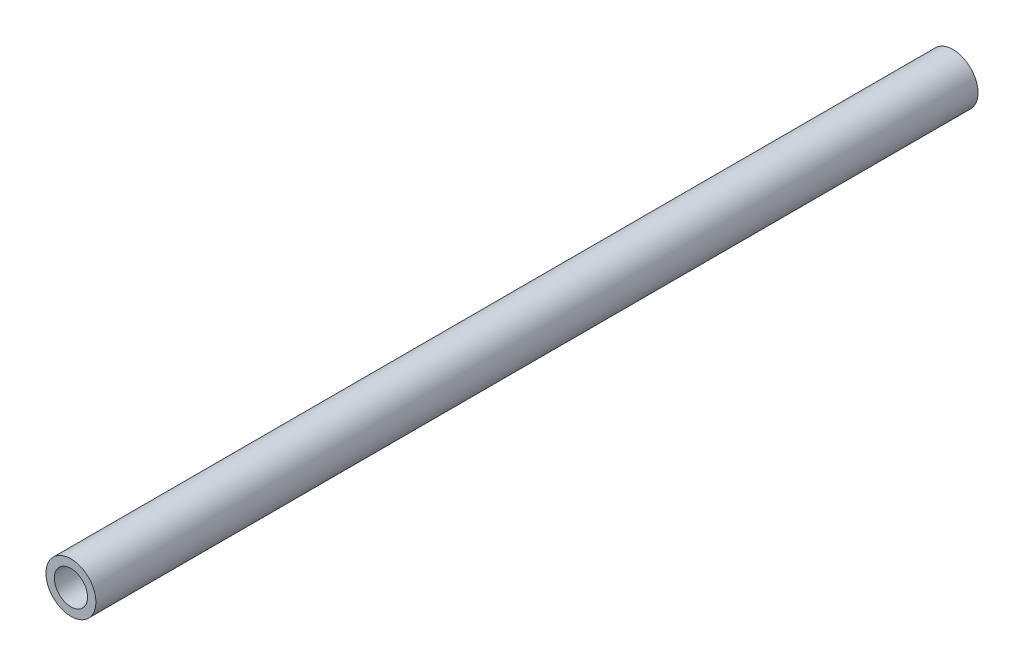
ISO-10303-21;
HEADER;
FILE_DESCRIPTION(('STEP AP214'),'2;1');
FILE_NAME('part.step','',(''),(''),'','','');
FILE_SCHEMA(('AUTOMOTIVE_DESIGN { 1 0 10303 214 1 1 1 1 }'));
ENDSEC;
DATA;
#1=APPLICATION_CONTEXT('core data for automotive mechanical design processes');
#2=APPLICATION_PROTOCOL_DEFINITION('international standard','automotive_design',2000,#1);
#3=PRODUCT_CONTEXT('',#1,'mechanical');
#4=PRODUCT('Part','Part','',(#3));
#5=PRODUCT_RELATED_PRODUCT_CATEGORY('part','',(#4));
#6=PRODUCT_DEFINITION_FORMATION('','',#4);
#7=PRODUCT_DEFINITION_CONTEXT('part definition',#1,'design');
#8=PRODUCT_DEFINITION('design','',#6,#7);
#9=PRODUCT_DEFINITION_SHAPE('','',#8);
#10=(LENGTH_UNIT() NAMED_UNIT(*) SI_UNIT(.MILLI.,.METRE.));
#11=(NAMED_UNIT(*) PLANE_ANGLE_UNIT() SI_UNIT($,.RADIAN.));
#12=(NAMED_UNIT(*) SI_UNIT($,.STERADIAN.) SOLID_ANGLE_UNIT());
#13=UNCERTAINTY_MEASURE_WITH_UNIT(LENGTH_MEASURE(1.E-05),#10,'distance_accuracy_value','');
#14=(GEOMETRIC_REPRESENTATION_CONTEXT(3) GLOBAL_UNCERTAINTY_ASSIGNED_CONTEXT((#13)) GLOBAL_UNIT_ASSIGNED_CONTEXT((#10,
#11,#12)) REPRESENTATION_CONTEXT('',''));
#15=CARTESIAN_POINT('',(0.,0.,0.));
#16=DIRECTION('',(0.,0.,1.));
#17=DIRECTION('',(1.,0.,0.));
#18=AXIS2_PLACEMENT_3D('',#15,#16,#17);
#19=CARTESIAN_POINT('',(0.,0.,265.));
#20=DIRECTION('',(0.,0.,1.));
#21=DIRECTION('',(1.,0.,0.));
#22=AXIS2_PLACEMENT_3D('',#19,#20,#21);
#23=PLANE('',#22);
#24=CARTESIAN_POINT('',(0.,0.,265.));
#25=DIRECTION('',(0.,0.,1.));
#26=DIRECTION('',(1.,0.,0.));
#27=AXIS2_PLACEMENT_3D('',#24,#25,#26);
#28=CIRCLE('',#27,7.5);
#29=CARTESIAN_POINT('',(7.5,0.,265.));
#30=VERTEX_POINT('',#29);
#31=EDGE_CURVE('E10',#30,#30,#28,.T.);
#32=ORIENTED_EDGE('',*,*,#31,.T.);
#33=EDGE_LOOP('',(#32));
#34=FACE_BOUND('',#33,.T.);
#35=CARTESIAN_POINT('',(0.,0.,265.));
#36=DIRECTION('',(0.,0.,1.));
#37=DIRECTION('',(1.,0.,0.));
#38=AXIS2_PLACEMENT_3D('',#35,#36,#37);
#39=CIRCLE('',#38,5.);
#40=CARTESIAN_POINT('',(5.,0.,265.));
#41=VERTEX_POINT('',#40);
#42=EDGE_CURVE('E48',#41,#41,#39,.T.);
#43=ORIENTED_EDGE('',*,*,#42,.F.);
#44=EDGE_LOOP('',(#43));
#45=FACE_BOUND('',#44,.T.);
#46=ADVANCED_FACE('F37',(#34,#45),#23,.T.);
#47=CARTESIAN_POINT('',(0.,0.,0.));
#48=DIRECTION('',(0.,0.,1.));
#49=DIRECTION('',(1.,0.,0.));
#50=AXIS2_PLACEMENT_3D('',#47,#48,#49);
#51=PLANE('',#50);
#52=CARTESIAN_POINT('',(0.,0.,0.));
#53=DIRECTION('',(0.,0.,1.));
#54=DIRECTION('',(1.,0.,0.));
#55=AXIS2_PLACEMENT_3D('',#52,#53,#54);
#56=CIRCLE('',#55,7.5);
#57=CARTESIAN_POINT('',(7.5,0.,0.));
#58=VERTEX_POINT('',#57);
#59=EDGE_CURVE('E41',#58,#58,#56,.T.);
#60=ORIENTED_EDGE('',*,*,#59,.F.);
#61=EDGE_LOOP('',(#60));
#62=FACE_BOUND('',#61,.T.);
#63=CARTESIAN_POINT('',(0.,0.,0.));
#64=DIRECTION('',(0.,0.,1.));
#65=DIRECTION('',(1.,0.,0.));
#66=AXIS2_PLACEMENT_3D('',#63,#64,#65);
#67=CIRCLE('',#66,5.);
#68=CARTESIAN_POINT('',(5.,0.,0.));
#69=VERTEX_POINT('',#68);
#70=EDGE_CURVE('E50',#69,#69,#67,.T.);
#71=ORIENTED_EDGE('',*,*,#70,.T.);
#72=EDGE_LOOP('',(#71));
#73=FACE_BOUND('',#72,.T.);
#74=ADVANCED_FACE('F60',(#62,#73),#51,.F.);
#75=CARTESIAN_POINT('',(0.,0.,265.));
#76=DIRECTION('',(0.,0.,-1.));
#77=DIRECTION('',(-1.,0.,0.));
#78=AXIS2_PLACEMENT_3D('',#75,#76,#77);
#79=CYLINDRICAL_SURFACE('',#78,7.5);
#80=ORIENTED_EDGE('',*,*,#31,.F.);
#81=EDGE_LOOP('',(#80));
#82=FACE_BOUND('',#81,.T.);
#83=ORIENTED_EDGE('',*,*,#59,.T.);
#84=EDGE_LOOP('',(#83));
#85=FACE_BOUND('',#84,.T.);
#86=ADVANCED_FACE('F39',(#82,#85),#79,.T.);
#87=CARTESIAN_POINT('',(0.,0.,265.));
#88=DIRECTION('',(0.,0.,-1.));
#89=DIRECTION('',(-1.,0.,0.));
#90=AXIS2_PLACEMENT_3D('',#87,#88,#89);
#91=CYLINDRICAL_SURFACE('',#90,5.);
#92=ORIENTED_EDGE('',*,*,#42,.T.);
#93=EDGE_LOOP('',(#92));
#94=FACE_BOUND('',#93,.T.);
#95=ORIENTED_EDGE('',*,*,#70,.F.);
#96=EDGE_LOOP('',(#95));
#97=FACE_BOUND('',#96,.T.);
#98=ADVANCED_FACE('F56',(#94,#97),#91,.F.);
#99=CLOSED_SHELL('',(#46,#74,#86,#98));
#100=MANIFOLD_SOLID_BREP('B2',#99);
#101=ADVANCED_BREP_SHAPE_REPRESENTATION('',(#18,#100),#14);
#102=SHAPE_DEFINITION_REPRESENTATION(#9,#101);
ENDSEC;
END-ISO-10303-21;
